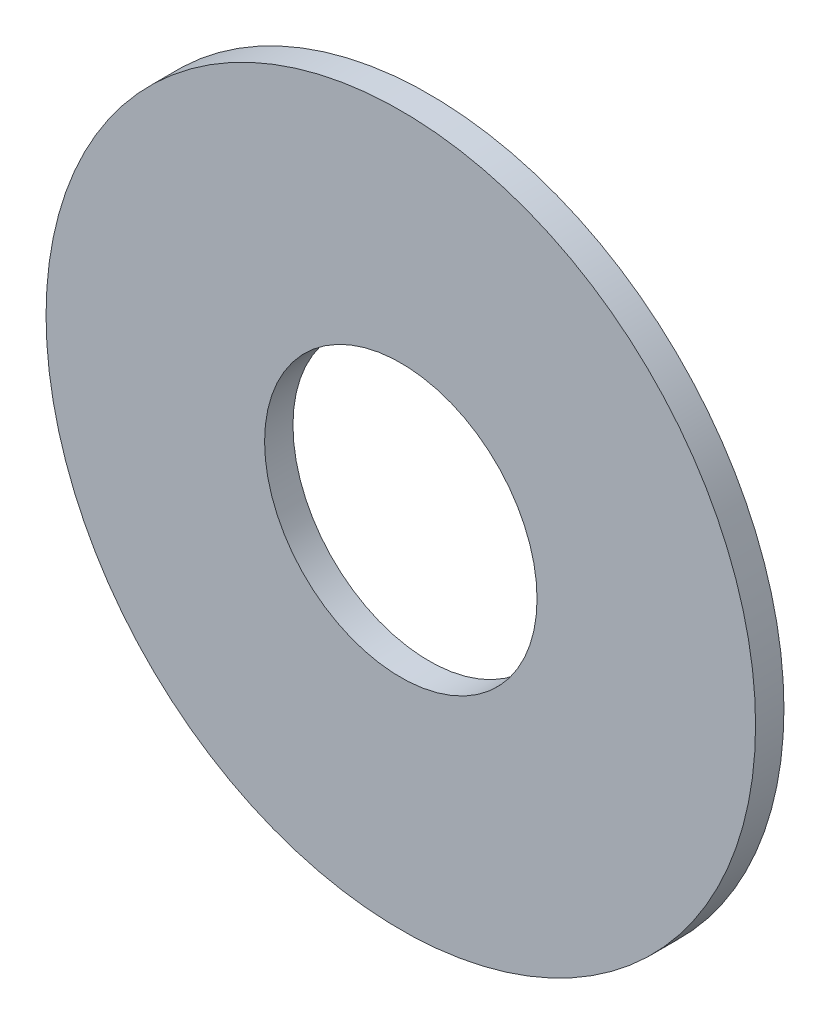
ISO-10303-21;
HEADER;
FILE_DESCRIPTION(('STEP AP214'),'2;1');
FILE_NAME('part.step','',(''),(''),'','','');
FILE_SCHEMA(('AUTOMOTIVE_DESIGN { 1 0 10303 214 1 1 1 1 }'));
ENDSEC;
DATA;
#1=APPLICATION_CONTEXT('core data for automotive mechanical design processes');
#2=APPLICATION_PROTOCOL_DEFINITION('international standard','automotive_design',2000,#1);
#3=PRODUCT_CONTEXT('',#1,'mechanical');
#4=PRODUCT('Part','Part','',(#3));
#5=PRODUCT_RELATED_PRODUCT_CATEGORY('part','',(#4));
#6=PRODUCT_DEFINITION_FORMATION('','',#4);
#7=PRODUCT_DEFINITION_CONTEXT('part definition',#1,'design');
#8=PRODUCT_DEFINITION('design','',#6,#7);
#9=PRODUCT_DEFINITION_SHAPE('','',#8);
#10=(LENGTH_UNIT() NAMED_UNIT(*) SI_UNIT(.MILLI.,.METRE.));
#11=(NAMED_UNIT(*) PLANE_ANGLE_UNIT() SI_UNIT($,.RADIAN.));
#12=(NAMED_UNIT(*) SI_UNIT($,.STERADIAN.) SOLID_ANGLE_UNIT());
#13=UNCERTAINTY_MEASURE_WITH_UNIT(LENGTH_MEASURE(1.E-05),#10,'distance_accuracy_value','');
#14=(GEOMETRIC_REPRESENTATION_CONTEXT(3) GLOBAL_UNCERTAINTY_ASSIGNED_CONTEXT((#13)) GLOBAL_UNIT_ASSIGNED_CONTEXT((#10,
#11,#12)) REPRESENTATION_CONTEXT('',''));
#15=CARTESIAN_POINT('',(0.,0.,0.));
#16=DIRECTION('',(0.,0.,1.));
#17=DIRECTION('',(1.,0.,0.));
#18=AXIS2_PLACEMENT_3D('',#15,#16,#17);
#19=CARTESIAN_POINT('',(0.,0.,0.5));
#20=DIRECTION('',(0.,0.,1.));
#21=DIRECTION('',(1.,0.,0.));
#22=AXIS2_PLACEMENT_3D('',#19,#20,#21);
#23=PLANE('',#22);
#24=CARTESIAN_POINT('',(0.,0.,0.5));
#25=DIRECTION('',(0.,0.,1.));
#26=DIRECTION('',(1.,0.,0.));
#27=AXIS2_PLACEMENT_3D('',#24,#25,#26);
#28=CIRCLE('',#27,6.25);
#29=CARTESIAN_POINT('',(6.25,0.,0.5));
#30=VERTEX_POINT('',#29);
#31=EDGE_CURVE('E10',#30,#30,#28,.T.);
#32=ORIENTED_EDGE('',*,*,#31,.T.);
#33=EDGE_LOOP('',(#32));
#34=FACE_BOUND('',#33,.T.);
#35=CARTESIAN_POINT('',(0.,0.,0.5));
#36=DIRECTION('',(0.,0.,1.));
#37=DIRECTION('',(1.,0.,0.));
#38=AXIS2_PLACEMENT_3D('',#35,#36,#37);
#39=CIRCLE('',#38,2.4);
#40=CARTESIAN_POINT('',(2.4,0.,0.5));
#41=VERTEX_POINT('',#40);
#42=EDGE_CURVE('E46',#41,#41,#39,.T.);
#43=ORIENTED_EDGE('',*,*,#42,.F.);
#44=EDGE_LOOP('',(#43));
#45=FACE_BOUND('',#44,.T.);
#46=ADVANCED_FACE('F35',(#34,#45),#23,.T.);
#47=CARTESIAN_POINT('',(0.,0.,0.));
#48=DIRECTION('',(0.,0.,1.));
#49=DIRECTION('',(1.,0.,0.));
#50=AXIS2_PLACEMENT_3D('',#47,#48,#49);
#51=PLANE('',#50);
#52=CARTESIAN_POINT('',(0.,0.,0.));
#53=DIRECTION('',(0.,0.,1.));
#54=DIRECTION('',(1.,0.,0.));
#55=AXIS2_PLACEMENT_3D('',#52,#53,#54);
#56=CIRCLE('',#55,6.25);
#57=CARTESIAN_POINT('',(6.25,0.,0.));
#58=VERTEX_POINT('',#57);
#59=EDGE_CURVE('E39',#58,#58,#56,.T.);
#60=ORIENTED_EDGE('',*,*,#59,.F.);
#61=EDGE_LOOP('',(#60));
#62=FACE_BOUND('',#61,.T.);
#63=CARTESIAN_POINT('',(0.,0.,0.));
#64=DIRECTION('',(0.,0.,1.));
#65=DIRECTION('',(1.,0.,0.));
#66=AXIS2_PLACEMENT_3D('',#63,#64,#65);
#67=CIRCLE('',#66,2.4);
#68=CARTESIAN_POINT('',(2.4,0.,0.));
#69=VERTEX_POINT('',#68);
#70=EDGE_CURVE('E48',#69,#69,#67,.T.);
#71=ORIENTED_EDGE('',*,*,#70,.T.);
#72=EDGE_LOOP('',(#71));
#73=FACE_BOUND('',#72,.T.);
#74=ADVANCED_FACE('F58',(#62,#73),#51,.F.);
#75=CARTESIAN_POINT('',(0.,0.,0.5));
#76=DIRECTION('',(0.,0.,-1.));
#77=DIRECTION('',(-1.,0.,0.));
#78=AXIS2_PLACEMENT_3D('',#75,#76,#77);
#79=CYLINDRICAL_SURFACE('',#78,6.25);
#80=ORIENTED_EDGE('',*,*,#31,.F.);
#81=EDGE_LOOP('',(#80));
#82=FACE_BOUND('',#81,.T.);
#83=ORIENTED_EDGE('',*,*,#59,.T.);
#84=EDGE_LOOP('',(#83));
#85=FACE_BOUND('',#84,.T.);
#86=ADVANCED_FACE('F37',(#82,#85),#79,.T.);
#87=CARTESIAN_POINT('',(0.,0.,0.5));
#88=DIRECTION('',(0.,0.,-1.));
#89=DIRECTION('',(-1.,0.,0.));
#90=AXIS2_PLACEMENT_3D('',#87,#88,#89);
#91=CYLINDRICAL_SURFACE('',#90,2.4);
#92=ORIENTED_EDGE('',*,*,#42,.T.);
#93=EDGE_LOOP('',(#92));
#94=FACE_BOUND('',#93,.T.);
#95=ORIENTED_EDGE('',*,*,#70,.F.);
#96=EDGE_LOOP('',(#95));
#97=FACE_BOUND('',#96,.T.);
#98=ADVANCED_FACE('F54',(#94,#97),#91,.F.);
#99=CLOSED_SHELL('',(#46,#74,#86,#98));
#100=MANIFOLD_SOLID_BREP('B2',#99);
#101=ADVANCED_BREP_SHAPE_REPRESENTATION('',(#18,#100),#14);
#102=SHAPE_DEFINITION_REPRESENTATION(#9,#101);
ENDSEC;
END-ISO-10303-21;
